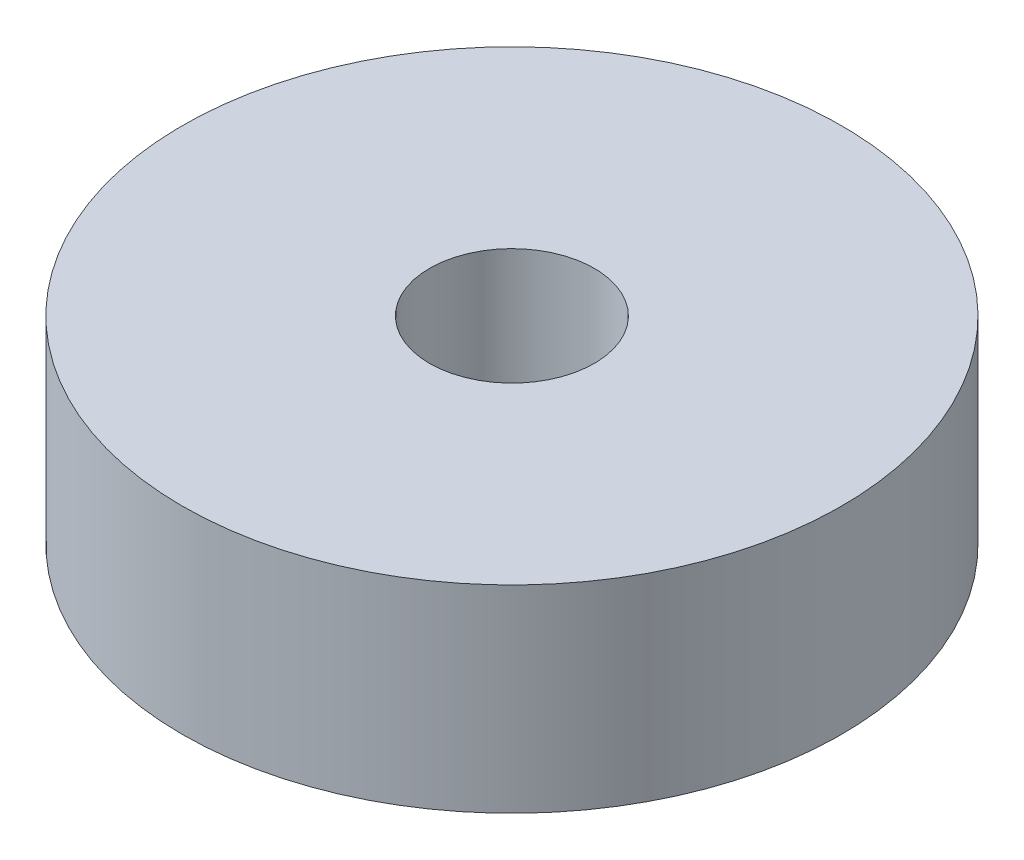
ISO-10303-21;
HEADER;
FILE_DESCRIPTION(('STEP AP214'),'2;1');
FILE_NAME('part.step','',(''),(''),'','','');
FILE_SCHEMA(('AUTOMOTIVE_DESIGN { 1 0 10303 214 1 1 1 1 }'));
ENDSEC;
DATA;
#1=APPLICATION_CONTEXT('core data for automotive mechanical design processes');
#2=APPLICATION_PROTOCOL_DEFINITION('international standard','automotive_design',2000,#1);
#3=PRODUCT_CONTEXT('',#1,'mechanical');
#4=PRODUCT('Part','Part','',(#3));
#5=PRODUCT_RELATED_PRODUCT_CATEGORY('part','',(#4));
#6=PRODUCT_DEFINITION_FORMATION('','',#4);
#7=PRODUCT_DEFINITION_CONTEXT('part definition',#1,'design');
#8=PRODUCT_DEFINITION('design','',#6,#7);
#9=PRODUCT_DEFINITION_SHAPE('','',#8);
#10=(LENGTH_UNIT() NAMED_UNIT(*) SI_UNIT(.MILLI.,.METRE.));
#11=(NAMED_UNIT(*) PLANE_ANGLE_UNIT() SI_UNIT($,.RADIAN.));
#12=(NAMED_UNIT(*) SI_UNIT($,.STERADIAN.) SOLID_ANGLE_UNIT());
#13=UNCERTAINTY_MEASURE_WITH_UNIT(LENGTH_MEASURE(1.E-05),#10,'distance_accuracy_value','');
#14=(GEOMETRIC_REPRESENTATION_CONTEXT(3) GLOBAL_UNCERTAINTY_ASSIGNED_CONTEXT((#13)) GLOBAL_UNIT_ASSIGNED_CONTEXT((#10,
#11,#12)) REPRESENTATION_CONTEXT('',''));
#15=CARTESIAN_POINT('',(0.,0.,0.));
#16=DIRECTION('',(0.,0.,1.));
#17=DIRECTION('',(1.,0.,0.));
#18=AXIS2_PLACEMENT_3D('',#15,#16,#17);
#19=CARTESIAN_POINT('',(0.,60.,0.));
#20=DIRECTION('',(0.,-1.,0.));
#21=DIRECTION('',(0.,0.,-1.));
#22=AXIS2_PLACEMENT_3D('',#19,#20,#21);
#23=CYLINDRICAL_SURFACE('',#22,100.);
#24=CARTESIAN_POINT('',(0.,60.,0.));
#25=DIRECTION('',(0.,1.,0.));
#26=DIRECTION('',(0.,0.,1.));
#27=AXIS2_PLACEMENT_3D('',#24,#25,#26);
#28=CIRCLE('',#27,100.);
#29=CARTESIAN_POINT('',(0.,60.,100.));
#30=VERTEX_POINT('',#29);
#31=EDGE_CURVE('E10',#30,#30,#28,.T.);
#32=ORIENTED_EDGE('',*,*,#31,.F.);
#33=EDGE_LOOP('',(#32));
#34=FACE_BOUND('',#33,.T.);
#35=CARTESIAN_POINT('',(0.,0.,0.));
#36=DIRECTION('',(0.,1.,0.));
#37=DIRECTION('',(0.,0.,1.));
#38=AXIS2_PLACEMENT_3D('',#35,#36,#37);
#39=CIRCLE('',#38,100.);
#40=CARTESIAN_POINT('',(0.,0.,100.));
#41=VERTEX_POINT('',#40);
#42=EDGE_CURVE('E38',#41,#41,#39,.T.);
#43=ORIENTED_EDGE('',*,*,#42,.T.);
#44=EDGE_LOOP('',(#43));
#45=FACE_BOUND('',#44,.T.);
#46=ADVANCED_FACE('F35',(#34,#45),#23,.T.);
#47=CARTESIAN_POINT('',(0.,60.,0.));
#48=DIRECTION('',(0.,1.,0.));
#49=DIRECTION('',(0.,0.,1.));
#50=AXIS2_PLACEMENT_3D('',#47,#48,#49);
#51=PLANE('',#50);
#52=CARTESIAN_POINT('',(0.,60.,0.));
#53=DIRECTION('',(0.,1.,0.));
#54=DIRECTION('',(0.,0.,1.));
#55=AXIS2_PLACEMENT_3D('',#52,#53,#54);
#56=CIRCLE('',#55,25.);
#57=CARTESIAN_POINT('',(0.,60.,25.));
#58=VERTEX_POINT('',#57);
#59=EDGE_CURVE('E47',#58,#58,#56,.T.);
#60=ORIENTED_EDGE('',*,*,#59,.F.);
#61=EDGE_LOOP('',(#60));
#62=FACE_BOUND('',#61,.T.);
#63=ORIENTED_EDGE('',*,*,#31,.T.);
#64=EDGE_LOOP('',(#63));
#65=FACE_BOUND('',#64,.T.);
#66=ADVANCED_FACE('F62',(#62,#65),#51,.T.);
#67=CARTESIAN_POINT('',(0.,0.,0.));
#68=DIRECTION('',(0.,1.,0.));
#69=DIRECTION('',(0.,0.,1.));
#70=AXIS2_PLACEMENT_3D('',#67,#68,#69);
#71=PLANE('',#70);
#72=ORIENTED_EDGE('',*,*,#42,.F.);
#73=EDGE_LOOP('',(#72));
#74=FACE_BOUND('',#73,.T.);
#75=ADVANCED_FACE('F58',(#74),#71,.F.);
#76=CARTESIAN_POINT('',(0.,9.99999999999999,0.));
#77=DIRECTION('',(0.,1.,0.));
#78=DIRECTION('',(0.,0.,1.));
#79=AXIS2_PLACEMENT_3D('',#76,#77,#78);
#80=CYLINDRICAL_SURFACE('',#79,25.);
#81=CARTESIAN_POINT('',(0.,9.99999999999999,0.));
#82=DIRECTION('',(0.,1.,0.));
#83=DIRECTION('',(0.,0.,1.));
#84=AXIS2_PLACEMENT_3D('',#81,#82,#83);
#85=CIRCLE('',#84,25.);
#86=CARTESIAN_POINT('',(0.,9.99999999999999,25.));
#87=VERTEX_POINT('',#86);
#88=EDGE_CURVE('E45',#87,#87,#85,.T.);
#89=ORIENTED_EDGE('',*,*,#88,.F.);
#90=EDGE_LOOP('',(#89));
#91=FACE_BOUND('',#90,.T.);
#92=ORIENTED_EDGE('',*,*,#59,.T.);
#93=EDGE_LOOP('',(#92));
#94=FACE_BOUND('',#93,.T.);
#95=ADVANCED_FACE('F55',(#91,#94),#80,.F.);
#96=CARTESIAN_POINT('',(0.,9.99999999999999,0.));
#97=DIRECTION('',(0.,1.,0.));
#98=DIRECTION('',(0.,0.,1.));
#99=AXIS2_PLACEMENT_3D('',#96,#97,#98);
#100=PLANE('',#99);
#101=ORIENTED_EDGE('',*,*,#88,.T.);
#102=EDGE_LOOP('',(#101));
#103=FACE_BOUND('',#102,.T.);
#104=ADVANCED_FACE('F53',(#103),#100,.T.);
#105=CLOSED_SHELL('',(#46,#66,#75,#95,#104));
#106=MANIFOLD_SOLID_BREP('B2',#105);
#107=ADVANCED_BREP_SHAPE_REPRESENTATION('',(#18,#106),#14);
#108=SHAPE_DEFINITION_REPRESENTATION(#9,#107);
ENDSEC;
END-ISO-10303-21;
